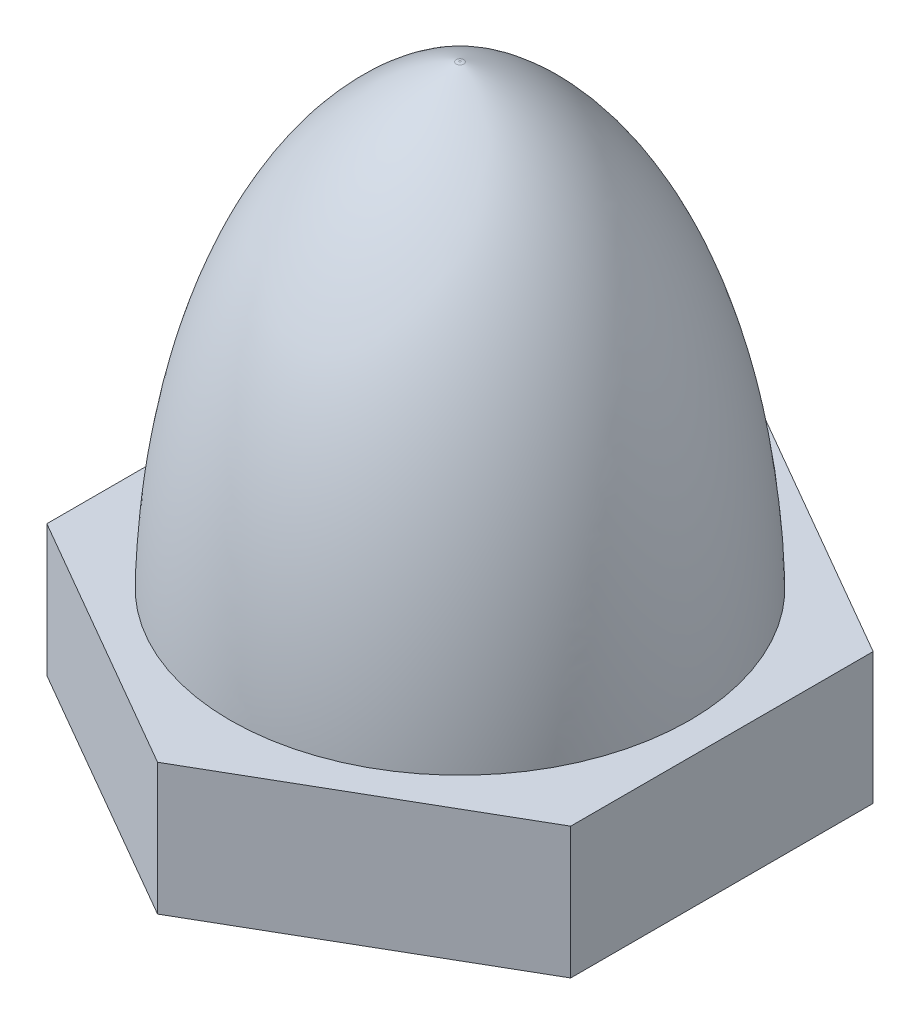
ISO-10303-21;
HEADER;
FILE_DESCRIPTION(('STEP AP214'),'2;1');
FILE_NAME('part.step','',(''),(''),'','','');
FILE_SCHEMA(('AUTOMOTIVE_DESIGN { 1 0 10303 214 1 1 1 1 }'));
ENDSEC;
DATA;
#1=APPLICATION_CONTEXT('core data for automotive mechanical design processes');
#2=APPLICATION_PROTOCOL_DEFINITION('international standard','automotive_design',2000,#1);
#3=PRODUCT_CONTEXT('',#1,'mechanical');
#4=PRODUCT('Part','Part','',(#3));
#5=PRODUCT_RELATED_PRODUCT_CATEGORY('part','',(#4));
#6=PRODUCT_DEFINITION_FORMATION('','',#4);
#7=PRODUCT_DEFINITION_CONTEXT('part definition',#1,'design');
#8=PRODUCT_DEFINITION('design','',#6,#7);
#9=PRODUCT_DEFINITION_SHAPE('','',#8);
#10=(LENGTH_UNIT() NAMED_UNIT(*) SI_UNIT(.MILLI.,.METRE.));
#11=(NAMED_UNIT(*) PLANE_ANGLE_UNIT() SI_UNIT($,.RADIAN.));
#12=(NAMED_UNIT(*) SI_UNIT($,.STERADIAN.) SOLID_ANGLE_UNIT());
#13=UNCERTAINTY_MEASURE_WITH_UNIT(LENGTH_MEASURE(1.E-05),#10,'distance_accuracy_value','');
#14=(GEOMETRIC_REPRESENTATION_CONTEXT(3) GLOBAL_UNCERTAINTY_ASSIGNED_CONTEXT((#13)) GLOBAL_UNIT_ASSIGNED_CONTEXT((#10,
#11,#12)) REPRESENTATION_CONTEXT('',''));
#15=CARTESIAN_POINT('',(0.,0.,0.));
#16=DIRECTION('',(0.,0.,1.));
#17=DIRECTION('',(1.,0.,0.));
#18=AXIS2_PLACEMENT_3D('',#15,#16,#17);
#19=CARTESIAN_POINT('',(-5.97557528611263,3.,3.45));
#20=DIRECTION('',(0.5,0.,-0.866025403784439));
#21=DIRECTION('',(-0.866025403784439,0.,-0.5));
#22=AXIS2_PLACEMENT_3D('',#19,#20,#21);
#23=PLANE('',#22);
#24=DIRECTION('',(0.866025403784439,0.,0.5));
#25=VECTOR('',#24,1.);
#26=CARTESIAN_POINT('',(-5.97557528611263,0.,3.45));
#27=LINE('',#26,#25);
#28=CARTESIAN_POINT('',(-5.97557528611263,0.,3.45));
#29=VERTEX_POINT('',#28);
#30=CARTESIAN_POINT('',(0.,0.,6.9));
#31=VERTEX_POINT('',#30);
#32=EDGE_CURVE('E124',#29,#31,#27,.T.);
#33=ORIENTED_EDGE('',*,*,#32,.T.);
#34=DIRECTION('',(0.,-1.,0.));
#35=VECTOR('',#34,1.);
#36=CARTESIAN_POINT('',(0.,3.,6.9));
#37=LINE('',#36,#35);
#38=CARTESIAN_POINT('',(0.,3.,6.9));
#39=VERTEX_POINT('',#38);
#40=EDGE_CURVE('E142',#39,#31,#37,.T.);
#41=ORIENTED_EDGE('',*,*,#40,.F.);
#42=DIRECTION('',(0.866025403784439,0.,0.5));
#43=VECTOR('',#42,1.);
#44=CARTESIAN_POINT('',(-5.97557528611263,3.,3.45));
#45=LINE('',#44,#43);
#46=CARTESIAN_POINT('',(-5.97557528611263,3.,3.45));
#47=VERTEX_POINT('',#46);
#48=EDGE_CURVE('E135',#47,#39,#45,.T.);
#49=ORIENTED_EDGE('',*,*,#48,.F.);
#50=DIRECTION('',(0.,-1.,0.));
#51=VECTOR('',#50,1.);
#52=CARTESIAN_POINT('',(-5.97557528611263,3.,3.45));
#53=LINE('',#52,#51);
#54=EDGE_CURVE('E120',#47,#29,#53,.T.);
#55=ORIENTED_EDGE('',*,*,#54,.T.);
#56=EDGE_LOOP('',(#33,#41,#49,#55));
#57=FACE_BOUND('',#56,.T.);
#58=ADVANCED_FACE('F37',(#57),#23,.F.);
#59=CARTESIAN_POINT('',(0.,3.,6.9));
#60=DIRECTION('',(-0.5,0.,-0.866025403784439));
#61=DIRECTION('',(-0.866025403784439,0.,0.5));
#62=AXIS2_PLACEMENT_3D('',#59,#60,#61);
#63=PLANE('',#62);
#64=DIRECTION('',(0.866025403784439,0.,-0.5));
#65=VECTOR('',#64,1.);
#66=CARTESIAN_POINT('',(0.,0.,6.9));
#67=LINE('',#66,#65);
#68=CARTESIAN_POINT('',(5.97557528611263,0.,3.45));
#69=VERTEX_POINT('',#68);
#70=EDGE_CURVE('E127',#31,#69,#67,.T.);
#71=ORIENTED_EDGE('',*,*,#70,.T.);
#72=DIRECTION('',(0.,-1.,0.));
#73=VECTOR('',#72,1.);
#74=CARTESIAN_POINT('',(5.97557528611263,3.,3.45));
#75=LINE('',#74,#73);
#76=CARTESIAN_POINT('',(5.97557528611263,3.,3.45));
#77=VERTEX_POINT('',#76);
#78=EDGE_CURVE('E139',#77,#69,#75,.T.);
#79=ORIENTED_EDGE('',*,*,#78,.F.);
#80=DIRECTION('',(0.866025403784439,0.,-0.5));
#81=VECTOR('',#80,1.);
#82=CARTESIAN_POINT('',(0.,3.,6.9));
#83=LINE('',#82,#81);
#84=EDGE_CURVE('E92',#39,#77,#83,.T.);
#85=ORIENTED_EDGE('',*,*,#84,.F.);
#86=ORIENTED_EDGE('',*,*,#40,.T.);
#87=EDGE_LOOP('',(#71,#79,#85,#86));
#88=FACE_BOUND('',#87,.T.);
#89=ADVANCED_FACE('F162',(#88),#63,.F.);
#90=CARTESIAN_POINT('',(5.97557528611263,3.,3.45));
#91=DIRECTION('',(-1.,0.,0.));
#92=DIRECTION('',(0.,0.,1.));
#93=AXIS2_PLACEMENT_3D('',#90,#91,#92);
#94=PLANE('',#93);
#95=DIRECTION('',(0.,0.,-1.));
#96=VECTOR('',#95,1.);
#97=CARTESIAN_POINT('',(5.97557528611263,0.,3.45));
#98=LINE('',#97,#96);
#99=CARTESIAN_POINT('',(5.97557528611262,0.,-3.45));
#100=VERTEX_POINT('',#99);
#101=EDGE_CURVE('E130',#69,#100,#98,.T.);
#102=ORIENTED_EDGE('',*,*,#101,.T.);
#103=DIRECTION('',(0.,-1.,0.));
#104=VECTOR('',#103,1.);
#105=CARTESIAN_POINT('',(5.97557528611262,3.,-3.45));
#106=LINE('',#105,#104);
#107=CARTESIAN_POINT('',(5.97557528611262,3.,-3.45));
#108=VERTEX_POINT('',#107);
#109=EDGE_CURVE('E115',#108,#100,#106,.T.);
#110=ORIENTED_EDGE('',*,*,#109,.F.);
#111=DIRECTION('',(0.,0.,-1.));
#112=VECTOR('',#111,1.);
#113=CARTESIAN_POINT('',(5.97557528611263,3.,3.45));
#114=LINE('',#113,#112);
#115=EDGE_CURVE('E106',#77,#108,#114,.T.);
#116=ORIENTED_EDGE('',*,*,#115,.F.);
#117=ORIENTED_EDGE('',*,*,#78,.T.);
#118=EDGE_LOOP('',(#102,#110,#116,#117));
#119=FACE_BOUND('',#118,.T.);
#120=ADVANCED_FACE('F167',(#119),#94,.F.);
#121=CARTESIAN_POINT('',(5.97557528611262,3.,-3.45));
#122=DIRECTION('',(-0.5,0.,0.866025403784439));
#123=DIRECTION('',(0.866025403784439,0.,0.5));
#124=AXIS2_PLACEMENT_3D('',#121,#122,#123);
#125=PLANE('',#124);
#126=DIRECTION('',(-0.866025403784439,0.,-0.5));
#127=VECTOR('',#126,1.);
#128=CARTESIAN_POINT('',(5.97557528611262,0.,-3.45));
#129=LINE('',#128,#127);
#130=CARTESIAN_POINT('',(0.,0.,-6.9));
#131=VERTEX_POINT('',#130);
#132=EDGE_CURVE('E114',#100,#131,#129,.T.);
#133=ORIENTED_EDGE('',*,*,#132,.T.);
#134=DIRECTION('',(0.,-1.,0.));
#135=VECTOR('',#134,1.);
#136=CARTESIAN_POINT('',(0.,3.,-6.9));
#137=LINE('',#136,#135);
#138=CARTESIAN_POINT('',(0.,3.,-6.9));
#139=VERTEX_POINT('',#138);
#140=EDGE_CURVE('E111',#139,#131,#137,.T.);
#141=ORIENTED_EDGE('',*,*,#140,.F.);
#142=DIRECTION('',(-0.866025403784439,0.,-0.5));
#143=VECTOR('',#142,1.);
#144=CARTESIAN_POINT('',(5.97557528611262,3.,-3.45));
#145=LINE('',#144,#143);
#146=EDGE_CURVE('E99',#108,#139,#145,.T.);
#147=ORIENTED_EDGE('',*,*,#146,.F.);
#148=ORIENTED_EDGE('',*,*,#109,.T.);
#149=EDGE_LOOP('',(#133,#141,#147,#148));
#150=FACE_BOUND('',#149,.T.);
#151=ADVANCED_FACE('F112',(#150),#125,.F.);
#152=CARTESIAN_POINT('',(0.,3.,-6.9));
#153=DIRECTION('',(0.5,0.,0.866025403784439));
#154=DIRECTION('',(0.866025403784439,0.,-0.5));
#155=AXIS2_PLACEMENT_3D('',#152,#153,#154);
#156=PLANE('',#155);
#157=DIRECTION('',(-0.866025403784439,0.,0.5));
#158=VECTOR('',#157,1.);
#159=CARTESIAN_POINT('',(0.,0.,-6.9));
#160=LINE('',#159,#158);
#161=CARTESIAN_POINT('',(-5.97557528611263,0.,-3.45));
#162=VERTEX_POINT('',#161);
#163=EDGE_CURVE('E77',#131,#162,#160,.T.);
#164=ORIENTED_EDGE('',*,*,#163,.T.);
#165=DIRECTION('',(0.,-1.,0.));
#166=VECTOR('',#165,1.);
#167=CARTESIAN_POINT('',(-5.97557528611263,3.,-3.45));
#168=LINE('',#167,#166);
#169=CARTESIAN_POINT('',(-5.97557528611263,3.,-3.45));
#170=VERTEX_POINT('',#169);
#171=EDGE_CURVE('E116',#170,#162,#168,.T.);
#172=ORIENTED_EDGE('',*,*,#171,.F.);
#173=DIRECTION('',(-0.866025403784439,0.,0.5));
#174=VECTOR('',#173,1.);
#175=CARTESIAN_POINT('',(0.,3.,-6.9));
#176=LINE('',#175,#174);
#177=EDGE_CURVE('E104',#139,#170,#176,.T.);
#178=ORIENTED_EDGE('',*,*,#177,.F.);
#179=ORIENTED_EDGE('',*,*,#140,.T.);
#180=EDGE_LOOP('',(#164,#172,#178,#179));
#181=FACE_BOUND('',#180,.T.);
#182=ADVANCED_FACE('F118',(#181),#156,.F.);
#183=CARTESIAN_POINT('',(-5.97557528611263,3.,-3.45));
#184=DIRECTION('',(1.,0.,0.));
#185=DIRECTION('',(0.,0.,-1.));
#186=AXIS2_PLACEMENT_3D('',#183,#184,#185);
#187=PLANE('',#186);
#188=DIRECTION('',(0.,0.,1.));
#189=VECTOR('',#188,1.);
#190=CARTESIAN_POINT('',(-5.97557528611263,0.,-3.45));
#191=LINE('',#190,#189);
#192=EDGE_CURVE('E83',#162,#29,#191,.T.);
#193=ORIENTED_EDGE('',*,*,#192,.T.);
#194=ORIENTED_EDGE('',*,*,#54,.F.);
#195=DIRECTION('',(0.,0.,1.));
#196=VECTOR('',#195,1.);
#197=CARTESIAN_POINT('',(-5.97557528611263,3.,-3.45));
#198=LINE('',#197,#196);
#199=EDGE_CURVE('E54',#170,#47,#198,.T.);
#200=ORIENTED_EDGE('',*,*,#199,.F.);
#201=ORIENTED_EDGE('',*,*,#171,.T.);
#202=EDGE_LOOP('',(#193,#194,#200,#201));
#203=FACE_BOUND('',#202,.T.);
#204=ADVANCED_FACE('F177',(#203),#187,.F.);
#205=CARTESIAN_POINT('',(0.,3.,0.));
#206=DIRECTION('',(0.,1.,0.));
#207=DIRECTION('',(0.,0.,1.));
#208=AXIS2_PLACEMENT_3D('',#205,#206,#207);
#209=PLANE('',#208);
#210=ORIENTED_EDGE('',*,*,#48,.T.);
#211=ORIENTED_EDGE('',*,*,#84,.T.);
#212=ORIENTED_EDGE('',*,*,#115,.T.);
#213=ORIENTED_EDGE('',*,*,#146,.T.);
#214=ORIENTED_EDGE('',*,*,#177,.T.);
#215=ORIENTED_EDGE('',*,*,#199,.T.);
#216=EDGE_LOOP('',(#210,#211,#212,#213,#214,#215));
#217=FACE_BOUND('',#216,.T.);
#218=CARTESIAN_POINT('',(0.,2.99999999999998,0.));
#219=DIRECTION('',(0.,1.,0.));
#220=DIRECTION('',(-1.,0.,0.));
#221=AXIS2_PLACEMENT_3D('',#218,#219,#220);
#222=CIRCLE('',#221,5.24277599733097);
#223=CARTESIAN_POINT('',(-5.24277599733097,2.99999999999998,0.));
#224=VERTEX_POINT('',#223);
#225=EDGE_CURVE('E128',#224,#224,#222,.T.);
#226=ORIENTED_EDGE('',*,*,#225,.F.);
#227=EDGE_LOOP('',(#226));
#228=FACE_BOUND('',#227,.T.);
#229=ADVANCED_FACE('F101',(#217,#228),#209,.T.);
#230=CARTESIAN_POINT('',(0.,0.,0.));
#231=DIRECTION('',(0.,1.,0.));
#232=DIRECTION('',(0.,0.,1.));
#233=AXIS2_PLACEMENT_3D('',#230,#231,#232);
#234=PLANE('',#233);
#235=CARTESIAN_POINT('',(0.,0.,0.));
#236=DIRECTION('',(0.,-1.,0.));
#237=DIRECTION('',(0.,0.,-1.));
#238=AXIS2_PLACEMENT_3D('',#235,#236,#237);
#239=CIRCLE('',#238,2.5);
#240=CARTESIAN_POINT('',(0.,0.,-2.5));
#241=VERTEX_POINT('',#240);
#242=EDGE_CURVE('E195',#241,#241,#239,.T.);
#243=ORIENTED_EDGE('',*,*,#242,.F.);
#244=EDGE_LOOP('',(#243));
#245=FACE_BOUND('',#244,.T.);
#246=ORIENTED_EDGE('',*,*,#32,.F.);
#247=ORIENTED_EDGE('',*,*,#192,.F.);
#248=ORIENTED_EDGE('',*,*,#163,.F.);
#249=ORIENTED_EDGE('',*,*,#132,.F.);
#250=ORIENTED_EDGE('',*,*,#101,.F.);
#251=ORIENTED_EDGE('',*,*,#70,.F.);
#252=EDGE_LOOP('',(#246,#247,#248,#249,#250,#251));
#253=FACE_BOUND('',#252,.T.);
#254=ADVANCED_FACE('F180',(#245,#253),#234,.F.);
#255=CARTESIAN_POINT('',(-4.54037720003992,2.99999999999998,-2.62138799866549));
#256=CARTESIAN_POINT('',(-4.44219244943973,7.59175773734786,-2.56470100647615));
#257=CARTESIAN_POINT('',(-3.07699381909672,12.1955421831902,-1.7765032097503));
#258=CARTESIAN_POINT('',(-0.0476774095603031,13.4,-0.027526565243905));
#259=B_SPLINE_CURVE_WITH_KNOTS('',3,(#255,#256,#257,#258),.UNSPECIFIED.,.F.,.F.,(4,4),
(0.00343086740114662,0.878426723997923),.UNSPECIFIED.);
#260=CARTESIAN_POINT('',(0.,16.4,0.));
#261=DIRECTION('',(0.,1.,0.));
#262=AXIS1_PLACEMENT('',#260,#261);
#263=SURFACE_OF_REVOLUTION('',#259,#262);
#264=CARTESIAN_POINT('',(0.,13.388679827312,0.));
#265=DIRECTION('',(0.,1.,0.));
#266=DIRECTION('',(-1.,0.,0.));
#267=AXIS2_PLACEMENT_3D('',#264,#265,#266);
#268=CIRCLE('',#267,0.0875879174464675);
#269=CARTESIAN_POINT('',(-0.0875879174464675,13.388679827312,0.));
#270=VERTEX_POINT('',#269);
#271=EDGE_CURVE('E11',#270,#270,#268,.F.);
#272=ORIENTED_EDGE('',*,*,#271,.T.);
#273=EDGE_LOOP('',(#272));
#274=FACE_BOUND('',#273,.T.);
#275=ORIENTED_EDGE('',*,*,#225,.T.);
#276=EDGE_LOOP('',(#275));
#277=FACE_BOUND('',#276,.T.);
#278=ADVANCED_FACE('F158',(#274,#277),#263,.T.);
#279=CARTESIAN_POINT('',(0.,13.4,0.));
#280=DIRECTION('',(0.,1.,0.));
#281=DIRECTION('',(0.,0.,1.));
#282=AXIS2_PLACEMENT_3D('',#279,#280,#281);
#283=PLANE('',#282);
#284=CARTESIAN_POINT('',(0.,13.4,0.));
#285=DIRECTION('',(0.,1.,0.));
#286=DIRECTION('',(0.,0.,1.));
#287=AXIS2_PLACEMENT_3D('',#284,#285,#286);
#288=CIRCLE('',#287,0.0212560038186873);
#289=CARTESIAN_POINT('',(0.,13.4,0.0212560038186873));
#290=VERTEX_POINT('',#289);
#291=EDGE_CURVE('E46',#290,#290,#288,.T.);
#292=ORIENTED_EDGE('',*,*,#291,.T.);
#293=EDGE_LOOP('',(#292));
#294=FACE_BOUND('',#293,.T.);
#295=ADVANCED_FACE('F146',(#294),#283,.T.);
#296=CARTESIAN_POINT('',(0.,13.2,0.));
#297=DIRECTION('',(0.,1.,0.));
#298=DIRECTION('',(-1.,0.,0.));
#299=AXIS2_PLACEMENT_3D('',#296,#297,#298);
#300=DEGENERATE_TOROIDAL_SURFACE('',#299,0.0212560038186873,0.2,.T.);
#301=ORIENTED_EDGE('',*,*,#271,.F.);
#302=EDGE_LOOP('',(#301));
#303=FACE_BOUND('',#302,.T.);
#304=ORIENTED_EDGE('',*,*,#291,.F.);
#305=EDGE_LOOP('',(#304));
#306=FACE_BOUND('',#305,.T.);
#307=ADVANCED_FACE('F39',(#303,#306),#300,.T.);
#308=CARTESIAN_POINT('',(0.,10.,0.));
#309=DIRECTION('',(0.,-1.,0.));
#310=DIRECTION('',(0.,0.,-1.));
#311=AXIS2_PLACEMENT_3D('',#308,#309,#310);
#312=CYLINDRICAL_SURFACE('',#311,2.5);
#313=CARTESIAN_POINT('',(0.,10.,0.));
#314=DIRECTION('',(0.,-1.,0.));
#315=DIRECTION('',(0.,0.,-1.));
#316=AXIS2_PLACEMENT_3D('',#313,#314,#315);
#317=CIRCLE('',#316,2.5);
#318=CARTESIAN_POINT('',(0.,10.,-2.5));
#319=VERTEX_POINT('',#318);
#320=EDGE_CURVE('E202',#319,#319,#317,.T.);
#321=ORIENTED_EDGE('',*,*,#320,.F.);
#322=EDGE_LOOP('',(#321));
#323=FACE_BOUND('',#322,.T.);
#324=ORIENTED_EDGE('',*,*,#242,.T.);
#325=EDGE_LOOP('',(#324));
#326=FACE_BOUND('',#325,.T.);
#327=ADVANCED_FACE('F149',(#323,#326),#312,.F.);
#328=CARTESIAN_POINT('',(0.,10.,0.));
#329=DIRECTION('',(0.,-1.,0.));
#330=DIRECTION('',(0.,0.,-1.));
#331=AXIS2_PLACEMENT_3D('',#328,#329,#330);
#332=PLANE('',#331);
#333=ORIENTED_EDGE('',*,*,#320,.T.);
#334=EDGE_LOOP('',(#333));
#335=FACE_BOUND('',#334,.T.);
#336=ADVANCED_FACE('F155',(#335),#332,.T.);
#337=CLOSED_SHELL('',(#58,#89,#120,#151,#182,#204,#229,#254,#278,#295,#307,#327,#336));
#338=MANIFOLD_SOLID_BREP('B2',#337);
#339=ADVANCED_BREP_SHAPE_REPRESENTATION('',(#18,#338),#14);
#340=SHAPE_DEFINITION_REPRESENTATION(#9,#339);
ENDSEC;
END-ISO-10303-21;
